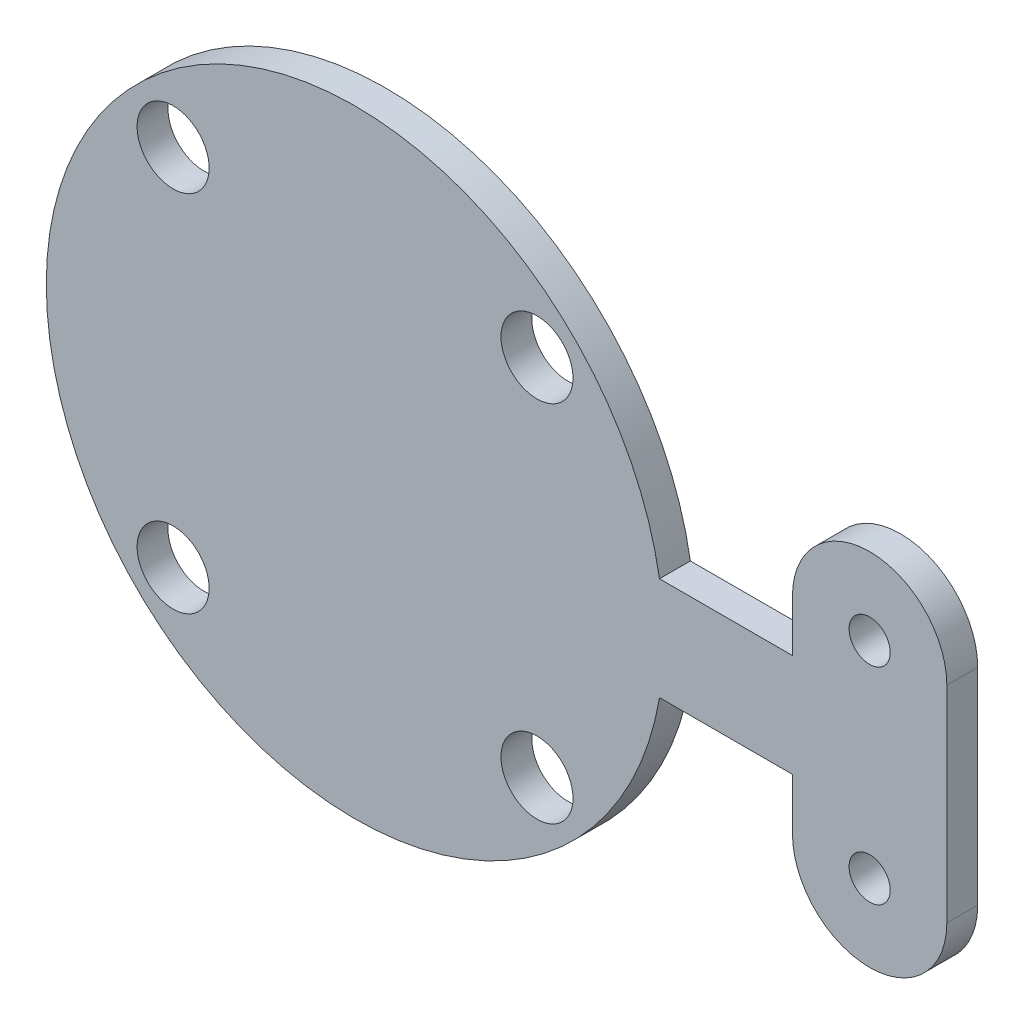
ISO-10303-21;
HEADER;
FILE_DESCRIPTION(('STEP AP214'),'2;1');
FILE_NAME('part.step','',(''),(''),'','','');
FILE_SCHEMA(('AUTOMOTIVE_DESIGN { 1 0 10303 214 1 1 1 1 }'));
ENDSEC;
DATA;
#1=APPLICATION_CONTEXT('core data for automotive mechanical design processes');
#2=APPLICATION_PROTOCOL_DEFINITION('international standard','automotive_design',2000,#1);
#3=PRODUCT_CONTEXT('',#1,'mechanical');
#4=PRODUCT('Part','Part','',(#3));
#5=PRODUCT_RELATED_PRODUCT_CATEGORY('part','',(#4));
#6=PRODUCT_DEFINITION_FORMATION('','',#4);
#7=PRODUCT_DEFINITION_CONTEXT('part definition',#1,'design');
#8=PRODUCT_DEFINITION('design','',#6,#7);
#9=PRODUCT_DEFINITION_SHAPE('','',#8);
#10=(LENGTH_UNIT() NAMED_UNIT(*) SI_UNIT(.MILLI.,.METRE.));
#11=(NAMED_UNIT(*) PLANE_ANGLE_UNIT() SI_UNIT($,.RADIAN.));
#12=(NAMED_UNIT(*) SI_UNIT($,.STERADIAN.) SOLID_ANGLE_UNIT());
#13=UNCERTAINTY_MEASURE_WITH_UNIT(LENGTH_MEASURE(1.E-05),#10,'distance_accuracy_value','');
#14=(GEOMETRIC_REPRESENTATION_CONTEXT(3) GLOBAL_UNCERTAINTY_ASSIGNED_CONTEXT((#13)) GLOBAL_UNIT_ASSIGNED_CONTEXT((#10,
#11,#12)) REPRESENTATION_CONTEXT('',''));
#15=CARTESIAN_POINT('',(0.,0.,0.));
#16=DIRECTION('',(0.,0.,1.));
#17=DIRECTION('',(1.,0.,0.));
#18=AXIS2_PLACEMENT_3D('',#15,#16,#17);
#19=CARTESIAN_POINT('',(0.,0.,3.));
#20=DIRECTION('',(0.,0.,-1.));
#21=DIRECTION('',(-1.,0.,0.));
#22=AXIS2_PLACEMENT_3D('',#19,#20,#21);
#23=CYLINDRICAL_SURFACE('',#22,30.);
#24=DIRECTION('',(0.,0.,-1.));
#25=VECTOR('',#24,1.);
#26=CARTESIAN_POINT('',(29.5803989154981,-5.,3.));
#27=LINE('',#26,#25);
#28=CARTESIAN_POINT('',(29.5803989154981,-5.,3.));
#29=VERTEX_POINT('',#28);
#30=CARTESIAN_POINT('',(29.5803989154981,-5.,0.));
#31=VERTEX_POINT('',#30);
#32=EDGE_CURVE('E183',#29,#31,#27,.T.);
#33=ORIENTED_EDGE('',*,*,#32,.F.);
#34=CARTESIAN_POINT('',(0.,0.,3.));
#35=DIRECTION('',(0.,0.,1.));
#36=DIRECTION('',(1.,0.,0.));
#37=AXIS2_PLACEMENT_3D('',#34,#35,#36);
#38=CIRCLE('',#37,30.);
#39=CARTESIAN_POINT('',(29.5803989154981,5.,3.));
#40=VERTEX_POINT('',#39);
#41=EDGE_CURVE('E47',#40,#29,#38,.T.);
#42=ORIENTED_EDGE('',*,*,#41,.F.);
#43=DIRECTION('',(0.,0.,-1.));
#44=VECTOR('',#43,1.);
#45=CARTESIAN_POINT('',(29.5803989154981,5.,3.));
#46=LINE('',#45,#44);
#47=CARTESIAN_POINT('',(29.5803989154981,5.,0.));
#48=VERTEX_POINT('',#47);
#49=EDGE_CURVE('E179',#48,#40,#46,.F.);
#50=ORIENTED_EDGE('',*,*,#49,.F.);
#51=CARTESIAN_POINT('',(0.,0.,0.));
#52=DIRECTION('',(0.,0.,1.));
#53=DIRECTION('',(1.,0.,0.));
#54=AXIS2_PLACEMENT_3D('',#51,#52,#53);
#55=CIRCLE('',#54,30.);
#56=EDGE_CURVE('E215',#48,#31,#55,.T.);
#57=ORIENTED_EDGE('',*,*,#56,.T.);
#58=EDGE_LOOP('',(#33,#42,#50,#57));
#59=FACE_BOUND('',#58,.T.);
#60=ADVANCED_FACE('F39',(#59),#23,.T.);
#61=CARTESIAN_POINT('',(0.,0.,3.));
#62=DIRECTION('',(0.,0.,1.));
#63=DIRECTION('',(1.,0.,0.));
#64=AXIS2_PLACEMENT_3D('',#61,#62,#63);
#65=PLANE('',#64);
#66=CARTESIAN_POINT('',(50.,10.,3.));
#67=DIRECTION('',(0.,0.,1.));
#68=DIRECTION('',(1.,0.,0.));
#69=AXIS2_PLACEMENT_3D('',#66,#67,#68);
#70=CIRCLE('',#69,2.);
#71=CARTESIAN_POINT('',(52.,10.,3.));
#72=VERTEX_POINT('',#71);
#73=EDGE_CURVE('E241',#72,#72,#70,.T.);
#74=ORIENTED_EDGE('',*,*,#73,.F.);
#75=EDGE_LOOP('',(#74));
#76=FACE_BOUND('',#75,.T.);
#77=CARTESIAN_POINT('',(50.,-10.,3.));
#78=DIRECTION('',(0.,0.,1.));
#79=DIRECTION('',(1.,0.,0.));
#80=AXIS2_PLACEMENT_3D('',#77,#78,#79);
#81=CIRCLE('',#80,2.);
#82=CARTESIAN_POINT('',(52.,-10.,3.));
#83=VERTEX_POINT('',#82);
#84=EDGE_CURVE('E141',#83,#83,#81,.T.);
#85=ORIENTED_EDGE('',*,*,#84,.F.);
#86=EDGE_LOOP('',(#85));
#87=FACE_BOUND('',#86,.T.);
#88=DIRECTION('',(-1.,0.,0.));
#89=VECTOR('',#88,1.);
#90=CARTESIAN_POINT('',(50.,-5.,3.));
#91=LINE('',#90,#89);
#92=CARTESIAN_POINT('',(42.5,-5.,3.));
#93=VERTEX_POINT('',#92);
#94=EDGE_CURVE('E176',#93,#29,#91,.T.);
#95=ORIENTED_EDGE('',*,*,#94,.F.);
#96=DIRECTION('',(0.,-1.,0.));
#97=VECTOR('',#96,1.);
#98=CARTESIAN_POINT('',(42.5,10.,3.));
#99=LINE('',#98,#97);
#100=CARTESIAN_POINT('',(42.5,-10.,3.));
#101=VERTEX_POINT('',#100);
#102=EDGE_CURVE('E152',#93,#101,#99,.T.);
#103=ORIENTED_EDGE('',*,*,#102,.T.);
#104=CARTESIAN_POINT('',(50.,-10.,3.));
#105=DIRECTION('',(0.,0.,1.));
#106=DIRECTION('',(1.,0.,0.));
#107=AXIS2_PLACEMENT_3D('',#104,#105,#106);
#108=CIRCLE('',#107,7.5);
#109=CARTESIAN_POINT('',(57.5,-10.,3.));
#110=VERTEX_POINT('',#109);
#111=EDGE_CURVE('E138',#101,#110,#108,.T.);
#112=ORIENTED_EDGE('',*,*,#111,.T.);
#113=DIRECTION('',(0.,1.,0.));
#114=VECTOR('',#113,1.);
#115=CARTESIAN_POINT('',(57.5,10.,3.));
#116=LINE('',#115,#114);
#117=CARTESIAN_POINT('',(57.5,10.,3.));
#118=VERTEX_POINT('',#117);
#119=EDGE_CURVE('E133',#110,#118,#116,.T.);
#120=ORIENTED_EDGE('',*,*,#119,.T.);
#121=CARTESIAN_POINT('',(50.,10.,3.));
#122=DIRECTION('',(0.,0.,1.));
#123=DIRECTION('',(1.,0.,0.));
#124=AXIS2_PLACEMENT_3D('',#121,#122,#123);
#125=CIRCLE('',#124,7.5);
#126=CARTESIAN_POINT('',(42.5,10.,3.));
#127=VERTEX_POINT('',#126);
#128=EDGE_CURVE('E149',#118,#127,#125,.T.);
#129=ORIENTED_EDGE('',*,*,#128,.T.);
#130=CARTESIAN_POINT('',(42.5,5.,3.));
#131=VERTEX_POINT('',#130);
#132=EDGE_CURVE('E107',#127,#131,#99,.T.);
#133=ORIENTED_EDGE('',*,*,#132,.T.);
#134=DIRECTION('',(-1.,0.,0.));
#135=VECTOR('',#134,1.);
#136=CARTESIAN_POINT('',(50.,5.,3.));
#137=LINE('',#136,#135);
#138=EDGE_CURVE('E169',#131,#40,#137,.T.);
#139=ORIENTED_EDGE('',*,*,#138,.T.);
#140=ORIENTED_EDGE('',*,*,#41,.T.);
#141=EDGE_LOOP('',(#95,#103,#112,#120,#129,#133,#139,#140));
#142=FACE_BOUND('',#141,.T.);
#143=CARTESIAN_POINT('',(-17.6776695296637,-17.6776695296637,3.));
#144=DIRECTION('',(0.,0.,1.));
#145=DIRECTION('',(-1.,0.,0.));
#146=AXIS2_PLACEMENT_3D('',#143,#144,#145);
#147=CIRCLE('',#146,3.5);
#148=CARTESIAN_POINT('',(-21.1776695296637,-17.6776695296637,3.));
#149=VERTEX_POINT('',#148);
#150=EDGE_CURVE('E186',#149,#149,#147,.T.);
#151=ORIENTED_EDGE('',*,*,#150,.F.);
#152=EDGE_LOOP('',(#151));
#153=FACE_BOUND('',#152,.T.);
#154=CARTESIAN_POINT('',(17.6776695296637,-17.6776695296637,3.));
#155=DIRECTION('',(0.,0.,1.));
#156=DIRECTION('',(1.,0.,0.));
#157=AXIS2_PLACEMENT_3D('',#154,#155,#156);
#158=CIRCLE('',#157,3.5);
#159=CARTESIAN_POINT('',(21.1776695296637,-17.6776695296637,3.));
#160=VERTEX_POINT('',#159);
#161=EDGE_CURVE('E200',#160,#160,#158,.T.);
#162=ORIENTED_EDGE('',*,*,#161,.F.);
#163=EDGE_LOOP('',(#162));
#164=FACE_BOUND('',#163,.T.);
#165=CARTESIAN_POINT('',(17.6776695296637,17.6776695296637,3.));
#166=DIRECTION('',(0.,0.,1.));
#167=DIRECTION('',(-1.,0.,0.));
#168=AXIS2_PLACEMENT_3D('',#165,#166,#167);
#169=CIRCLE('',#168,3.5);
#170=CARTESIAN_POINT('',(14.1776695296637,17.6776695296637,3.));
#171=VERTEX_POINT('',#170);
#172=EDGE_CURVE('E192',#171,#171,#169,.T.);
#173=ORIENTED_EDGE('',*,*,#172,.F.);
#174=EDGE_LOOP('',(#173));
#175=FACE_BOUND('',#174,.T.);
#176=CARTESIAN_POINT('',(-17.6776695296637,17.6776695296637,3.));
#177=DIRECTION('',(0.,0.,1.));
#178=DIRECTION('',(1.,0.,0.));
#179=AXIS2_PLACEMENT_3D('',#176,#177,#178);
#180=CIRCLE('',#179,3.5);
#181=CARTESIAN_POINT('',(-14.1776695296637,17.6776695296637,3.));
#182=VERTEX_POINT('',#181);
#183=EDGE_CURVE('E191',#182,#182,#180,.T.);
#184=ORIENTED_EDGE('',*,*,#183,.F.);
#185=EDGE_LOOP('',(#184));
#186=FACE_BOUND('',#185,.T.);
#187=ADVANCED_FACE('F230',(#76,#87,#142,#153,#164,#175,#186),#65,.T.);
#188=CARTESIAN_POINT('',(0.,0.,0.));
#189=DIRECTION('',(0.,0.,1.));
#190=DIRECTION('',(1.,0.,0.));
#191=AXIS2_PLACEMENT_3D('',#188,#189,#190);
#192=PLANE('',#191);
#193=CARTESIAN_POINT('',(50.,10.,0.));
#194=DIRECTION('',(0.,0.,1.));
#195=DIRECTION('',(1.,0.,0.));
#196=AXIS2_PLACEMENT_3D('',#193,#194,#195);
#197=CIRCLE('',#196,2.);
#198=CARTESIAN_POINT('',(52.,10.,0.));
#199=VERTEX_POINT('',#198);
#200=EDGE_CURVE('E153',#199,#199,#197,.T.);
#201=ORIENTED_EDGE('',*,*,#200,.T.);
#202=EDGE_LOOP('',(#201));
#203=FACE_BOUND('',#202,.T.);
#204=CARTESIAN_POINT('',(50.,-10.,0.));
#205=DIRECTION('',(0.,0.,1.));
#206=DIRECTION('',(1.,0.,0.));
#207=AXIS2_PLACEMENT_3D('',#204,#205,#206);
#208=CIRCLE('',#207,2.);
#209=CARTESIAN_POINT('',(52.,-10.,0.));
#210=VERTEX_POINT('',#209);
#211=EDGE_CURVE('E245',#210,#210,#208,.T.);
#212=ORIENTED_EDGE('',*,*,#211,.T.);
#213=EDGE_LOOP('',(#212));
#214=FACE_BOUND('',#213,.T.);
#215=DIRECTION('',(-1.,0.,0.));
#216=VECTOR('',#215,1.);
#217=CARTESIAN_POINT('',(50.,5.,0.));
#218=LINE('',#217,#216);
#219=CARTESIAN_POINT('',(42.5,5.,0.));
#220=VERTEX_POINT('',#219);
#221=EDGE_CURVE('E125',#220,#48,#218,.T.);
#222=ORIENTED_EDGE('',*,*,#221,.F.);
#223=DIRECTION('',(0.,-1.,0.));
#224=VECTOR('',#223,1.);
#225=CARTESIAN_POINT('',(42.5,10.,0.));
#226=LINE('',#225,#224);
#227=CARTESIAN_POINT('',(42.5,10.,0.));
#228=VERTEX_POINT('',#227);
#229=EDGE_CURVE('E105',#228,#220,#226,.T.);
#230=ORIENTED_EDGE('',*,*,#229,.F.);
#231=CARTESIAN_POINT('',(50.,10.,0.));
#232=DIRECTION('',(0.,0.,1.));
#233=DIRECTION('',(1.,0.,0.));
#234=AXIS2_PLACEMENT_3D('',#231,#232,#233);
#235=CIRCLE('',#234,7.5);
#236=CARTESIAN_POINT('',(57.5,10.,0.));
#237=VERTEX_POINT('',#236);
#238=EDGE_CURVE('E122',#237,#228,#235,.T.);
#239=ORIENTED_EDGE('',*,*,#238,.F.);
#240=DIRECTION('',(0.,1.,0.));
#241=VECTOR('',#240,1.);
#242=CARTESIAN_POINT('',(57.5,10.,0.));
#243=LINE('',#242,#241);
#244=CARTESIAN_POINT('',(57.5,-10.,0.));
#245=VERTEX_POINT('',#244);
#246=EDGE_CURVE('E114',#245,#237,#243,.T.);
#247=ORIENTED_EDGE('',*,*,#246,.F.);
#248=CARTESIAN_POINT('',(50.,-10.,0.));
#249=DIRECTION('',(0.,0.,1.));
#250=DIRECTION('',(1.,0.,0.));
#251=AXIS2_PLACEMENT_3D('',#248,#249,#250);
#252=CIRCLE('',#251,7.5);
#253=CARTESIAN_POINT('',(42.5,-10.,0.));
#254=VERTEX_POINT('',#253);
#255=EDGE_CURVE('E127',#254,#245,#252,.T.);
#256=ORIENTED_EDGE('',*,*,#255,.F.);
#257=CARTESIAN_POINT('',(42.5,-5.,0.));
#258=VERTEX_POINT('',#257);
#259=EDGE_CURVE('E128',#258,#254,#226,.T.);
#260=ORIENTED_EDGE('',*,*,#259,.F.);
#261=DIRECTION('',(-1.,0.,0.));
#262=VECTOR('',#261,1.);
#263=CARTESIAN_POINT('',(50.,-5.,0.));
#264=LINE('',#263,#262);
#265=EDGE_CURVE('E54',#258,#31,#264,.T.);
#266=ORIENTED_EDGE('',*,*,#265,.T.);
#267=ORIENTED_EDGE('',*,*,#56,.F.);
#268=EDGE_LOOP('',(#222,#230,#239,#247,#256,#260,#266,#267));
#269=FACE_BOUND('',#268,.T.);
#270=CARTESIAN_POINT('',(-17.6776695296637,17.6776695296637,0.));
#271=DIRECTION('',(0.,0.,1.));
#272=DIRECTION('',(1.,0.,0.));
#273=AXIS2_PLACEMENT_3D('',#270,#271,#272);
#274=CIRCLE('',#273,3.5);
#275=CARTESIAN_POINT('',(-14.1776695296637,17.6776695296637,0.));
#276=VERTEX_POINT('',#275);
#277=EDGE_CURVE('E211',#276,#276,#274,.T.);
#278=ORIENTED_EDGE('',*,*,#277,.T.);
#279=EDGE_LOOP('',(#278));
#280=FACE_BOUND('',#279,.T.);
#281=CARTESIAN_POINT('',(17.6776695296637,17.6776695296637,0.));
#282=DIRECTION('',(0.,0.,1.));
#283=DIRECTION('',(-1.,0.,0.));
#284=AXIS2_PLACEMENT_3D('',#281,#282,#283);
#285=CIRCLE('',#284,3.5);
#286=CARTESIAN_POINT('',(14.1776695296637,17.6776695296637,0.));
#287=VERTEX_POINT('',#286);
#288=EDGE_CURVE('E187',#287,#287,#285,.T.);
#289=ORIENTED_EDGE('',*,*,#288,.T.);
#290=EDGE_LOOP('',(#289));
#291=FACE_BOUND('',#290,.T.);
#292=CARTESIAN_POINT('',(17.6776695296637,-17.6776695296637,0.));
#293=DIRECTION('',(0.,0.,1.));
#294=DIRECTION('',(1.,0.,0.));
#295=AXIS2_PLACEMENT_3D('',#292,#293,#294);
#296=CIRCLE('',#295,3.5);
#297=CARTESIAN_POINT('',(21.1776695296637,-17.6776695296637,0.));
#298=VERTEX_POINT('',#297);
#299=EDGE_CURVE('E196',#298,#298,#296,.T.);
#300=ORIENTED_EDGE('',*,*,#299,.T.);
#301=EDGE_LOOP('',(#300));
#302=FACE_BOUND('',#301,.T.);
#303=CARTESIAN_POINT('',(-17.6776695296637,-17.6776695296637,0.));
#304=DIRECTION('',(0.,0.,1.));
#305=DIRECTION('',(-1.,0.,0.));
#306=AXIS2_PLACEMENT_3D('',#303,#304,#305);
#307=CIRCLE('',#306,3.5);
#308=CARTESIAN_POINT('',(-21.1776695296637,-17.6776695296637,0.));
#309=VERTEX_POINT('',#308);
#310=EDGE_CURVE('E204',#309,#309,#307,.T.);
#311=ORIENTED_EDGE('',*,*,#310,.T.);
#312=EDGE_LOOP('',(#311));
#313=FACE_BOUND('',#312,.T.);
#314=ADVANCED_FACE('F119',(#203,#214,#269,#280,#291,#302,#313),#192,.F.);
#315=CARTESIAN_POINT('',(-17.6776695296637,17.6776695296637,0.));
#316=DIRECTION('',(0.,0.,1.));
#317=DIRECTION('',(1.,0.,0.));
#318=AXIS2_PLACEMENT_3D('',#315,#316,#317);
#319=CYLINDRICAL_SURFACE('',#318,3.5);
#320=ORIENTED_EDGE('',*,*,#277,.F.);
#321=EDGE_LOOP('',(#320));
#322=FACE_BOUND('',#321,.T.);
#323=ORIENTED_EDGE('',*,*,#183,.T.);
#324=EDGE_LOOP('',(#323));
#325=FACE_BOUND('',#324,.T.);
#326=ADVANCED_FACE('F261',(#322,#325),#319,.F.);
#327=CARTESIAN_POINT('',(17.6776695296637,17.6776695296637,0.));
#328=DIRECTION('',(0.,0.,1.));
#329=DIRECTION('',(1.,0.,0.));
#330=AXIS2_PLACEMENT_3D('',#327,#328,#329);
#331=CYLINDRICAL_SURFACE('',#330,3.5);
#332=ORIENTED_EDGE('',*,*,#288,.F.);
#333=EDGE_LOOP('',(#332));
#334=FACE_BOUND('',#333,.T.);
#335=ORIENTED_EDGE('',*,*,#172,.T.);
#336=EDGE_LOOP('',(#335));
#337=FACE_BOUND('',#336,.T.);
#338=ADVANCED_FACE('F267',(#334,#337),#331,.F.);
#339=CARTESIAN_POINT('',(17.6776695296637,-17.6776695296637,0.));
#340=DIRECTION('',(0.,0.,1.));
#341=DIRECTION('',(1.,0.,0.));
#342=AXIS2_PLACEMENT_3D('',#339,#340,#341);
#343=CYLINDRICAL_SURFACE('',#342,3.5);
#344=ORIENTED_EDGE('',*,*,#299,.F.);
#345=EDGE_LOOP('',(#344));
#346=FACE_BOUND('',#345,.T.);
#347=ORIENTED_EDGE('',*,*,#161,.T.);
#348=EDGE_LOOP('',(#347));
#349=FACE_BOUND('',#348,.T.);
#350=ADVANCED_FACE('F272',(#346,#349),#343,.F.);
#351=CARTESIAN_POINT('',(-17.6776695296637,-17.6776695296637,0.));
#352=DIRECTION('',(0.,0.,1.));
#353=DIRECTION('',(1.,0.,0.));
#354=AXIS2_PLACEMENT_3D('',#351,#352,#353);
#355=CYLINDRICAL_SURFACE('',#354,3.5);
#356=ORIENTED_EDGE('',*,*,#310,.F.);
#357=EDGE_LOOP('',(#356));
#358=FACE_BOUND('',#357,.T.);
#359=ORIENTED_EDGE('',*,*,#150,.T.);
#360=EDGE_LOOP('',(#359));
#361=FACE_BOUND('',#360,.T.);
#362=ADVANCED_FACE('F269',(#358,#361),#355,.F.);
#363=CARTESIAN_POINT('',(50.,-5.,0.));
#364=DIRECTION('',(0.,1.,0.));
#365=DIRECTION('',(0.,0.,1.));
#366=AXIS2_PLACEMENT_3D('',#363,#364,#365);
#367=PLANE('',#366);
#368=ORIENTED_EDGE('',*,*,#265,.F.);
#369=DIRECTION('',(0.,0.,1.));
#370=VECTOR('',#369,1.);
#371=CARTESIAN_POINT('',(42.5,-5.,0.));
#372=LINE('',#371,#370);
#373=EDGE_CURVE('E58',#258,#93,#372,.T.);
#374=ORIENTED_EDGE('',*,*,#373,.T.);
#375=ORIENTED_EDGE('',*,*,#94,.T.);
#376=ORIENTED_EDGE('',*,*,#32,.T.);
#377=EDGE_LOOP('',(#368,#374,#375,#376));
#378=FACE_BOUND('',#377,.T.);
#379=ADVANCED_FACE('F227',(#378),#367,.F.);
#380=CARTESIAN_POINT('',(50.,5.,0.));
#381=DIRECTION('',(0.,-1.,0.));
#382=DIRECTION('',(0.,0.,-1.));
#383=AXIS2_PLACEMENT_3D('',#380,#381,#382);
#384=PLANE('',#383);
#385=ORIENTED_EDGE('',*,*,#138,.F.);
#386=DIRECTION('',(0.,0.,-1.));
#387=VECTOR('',#386,1.);
#388=CARTESIAN_POINT('',(42.5,5.,0.));
#389=LINE('',#388,#387);
#390=EDGE_CURVE('E11',#131,#220,#389,.T.);
#391=ORIENTED_EDGE('',*,*,#390,.T.);
#392=ORIENTED_EDGE('',*,*,#221,.T.);
#393=ORIENTED_EDGE('',*,*,#49,.T.);
#394=EDGE_LOOP('',(#385,#391,#392,#393));
#395=FACE_BOUND('',#394,.T.);
#396=ADVANCED_FACE('F282',(#395),#384,.F.);
#397=CARTESIAN_POINT('',(42.5,10.,0.));
#398=DIRECTION('',(-1.,0.,0.));
#399=DIRECTION('',(0.,0.,1.));
#400=AXIS2_PLACEMENT_3D('',#397,#398,#399);
#401=PLANE('',#400);
#402=ORIENTED_EDGE('',*,*,#373,.F.);
#403=ORIENTED_EDGE('',*,*,#259,.T.);
#404=DIRECTION('',(0.,0.,1.));
#405=VECTOR('',#404,1.);
#406=CARTESIAN_POINT('',(42.5,-10.,0.));
#407=LINE('',#406,#405);
#408=EDGE_CURVE('E113',#254,#101,#407,.T.);
#409=ORIENTED_EDGE('',*,*,#408,.T.);
#410=ORIENTED_EDGE('',*,*,#102,.F.);
#411=EDGE_LOOP('',(#402,#403,#409,#410));
#412=FACE_BOUND('',#411,.T.);
#413=ADVANCED_FACE('F233',(#412),#401,.T.);
#414=ORIENTED_EDGE('',*,*,#390,.F.);
#415=ORIENTED_EDGE('',*,*,#132,.F.);
#416=DIRECTION('',(0.,0.,1.));
#417=VECTOR('',#416,1.);
#418=CARTESIAN_POINT('',(42.5,10.,0.));
#419=LINE('',#418,#417);
#420=EDGE_CURVE('E101',#228,#127,#419,.T.);
#421=ORIENTED_EDGE('',*,*,#420,.F.);
#422=ORIENTED_EDGE('',*,*,#229,.T.);
#423=EDGE_LOOP('',(#414,#415,#421,#422));
#424=FACE_BOUND('',#423,.T.);
#425=ADVANCED_FACE('F104',(#424),#401,.T.);
#426=CARTESIAN_POINT('',(50.,10.,0.));
#427=DIRECTION('',(0.,0.,1.));
#428=DIRECTION('',(1.,0.,0.));
#429=AXIS2_PLACEMENT_3D('',#426,#427,#428);
#430=CYLINDRICAL_SURFACE('',#429,7.5);
#431=ORIENTED_EDGE('',*,*,#128,.F.);
#432=DIRECTION('',(0.,0.,1.));
#433=VECTOR('',#432,1.);
#434=CARTESIAN_POINT('',(57.5,10.,0.));
#435=LINE('',#434,#433);
#436=EDGE_CURVE('E131',#237,#118,#435,.T.);
#437=ORIENTED_EDGE('',*,*,#436,.F.);
#438=ORIENTED_EDGE('',*,*,#238,.T.);
#439=ORIENTED_EDGE('',*,*,#420,.T.);
#440=EDGE_LOOP('',(#431,#437,#438,#439));
#441=FACE_BOUND('',#440,.T.);
#442=ADVANCED_FACE('F130',(#441),#430,.T.);
#443=CARTESIAN_POINT('',(57.5,10.,0.));
#444=DIRECTION('',(1.,0.,0.));
#445=DIRECTION('',(0.,0.,-1.));
#446=AXIS2_PLACEMENT_3D('',#443,#444,#445);
#447=PLANE('',#446);
#448=ORIENTED_EDGE('',*,*,#119,.F.);
#449=DIRECTION('',(0.,0.,1.));
#450=VECTOR('',#449,1.);
#451=CARTESIAN_POINT('',(57.5,-10.,0.));
#452=LINE('',#451,#450);
#453=EDGE_CURVE('E161',#245,#110,#452,.T.);
#454=ORIENTED_EDGE('',*,*,#453,.F.);
#455=ORIENTED_EDGE('',*,*,#246,.T.);
#456=ORIENTED_EDGE('',*,*,#436,.T.);
#457=EDGE_LOOP('',(#448,#454,#455,#456));
#458=FACE_BOUND('',#457,.T.);
#459=ADVANCED_FACE('F288',(#458),#447,.T.);
#460=CARTESIAN_POINT('',(50.,-10.,0.));
#461=DIRECTION('',(0.,0.,1.));
#462=DIRECTION('',(1.,0.,0.));
#463=AXIS2_PLACEMENT_3D('',#460,#461,#462);
#464=CYLINDRICAL_SURFACE('',#463,7.5);
#465=ORIENTED_EDGE('',*,*,#111,.F.);
#466=ORIENTED_EDGE('',*,*,#408,.F.);
#467=ORIENTED_EDGE('',*,*,#255,.T.);
#468=ORIENTED_EDGE('',*,*,#453,.T.);
#469=EDGE_LOOP('',(#465,#466,#467,#468));
#470=FACE_BOUND('',#469,.T.);
#471=ADVANCED_FACE('F291',(#470),#464,.T.);
#472=CARTESIAN_POINT('',(50.,-10.,0.));
#473=DIRECTION('',(0.,0.,1.));
#474=DIRECTION('',(1.,0.,0.));
#475=AXIS2_PLACEMENT_3D('',#472,#473,#474);
#476=CYLINDRICAL_SURFACE('',#475,2.);
#477=ORIENTED_EDGE('',*,*,#211,.F.);
#478=EDGE_LOOP('',(#477));
#479=FACE_BOUND('',#478,.T.);
#480=ORIENTED_EDGE('',*,*,#84,.T.);
#481=EDGE_LOOP('',(#480));
#482=FACE_BOUND('',#481,.T.);
#483=ADVANCED_FACE('F252',(#479,#482),#476,.F.);
#484=CARTESIAN_POINT('',(50.,10.,0.));
#485=DIRECTION('',(0.,0.,1.));
#486=DIRECTION('',(1.,0.,0.));
#487=AXIS2_PLACEMENT_3D('',#484,#485,#486);
#488=CYLINDRICAL_SURFACE('',#487,2.);
#489=ORIENTED_EDGE('',*,*,#200,.F.);
#490=EDGE_LOOP('',(#489));
#491=FACE_BOUND('',#490,.T.);
#492=ORIENTED_EDGE('',*,*,#73,.T.);
#493=EDGE_LOOP('',(#492));
#494=FACE_BOUND('',#493,.T.);
#495=ADVANCED_FACE('F300',(#491,#494),#488,.F.);
#496=CLOSED_SHELL('',(#60,#187,#314,#326,#338,#350,#362,#379,#396,#413,#425,#442,#459,#471,#483,#495));
#497=MANIFOLD_SOLID_BREP('B2',#496);
#498=ADVANCED_BREP_SHAPE_REPRESENTATION('',(#18,#497),#14);
#499=SHAPE_DEFINITION_REPRESENTATION(#9,#498);
ENDSEC;
END-ISO-10303-21;
